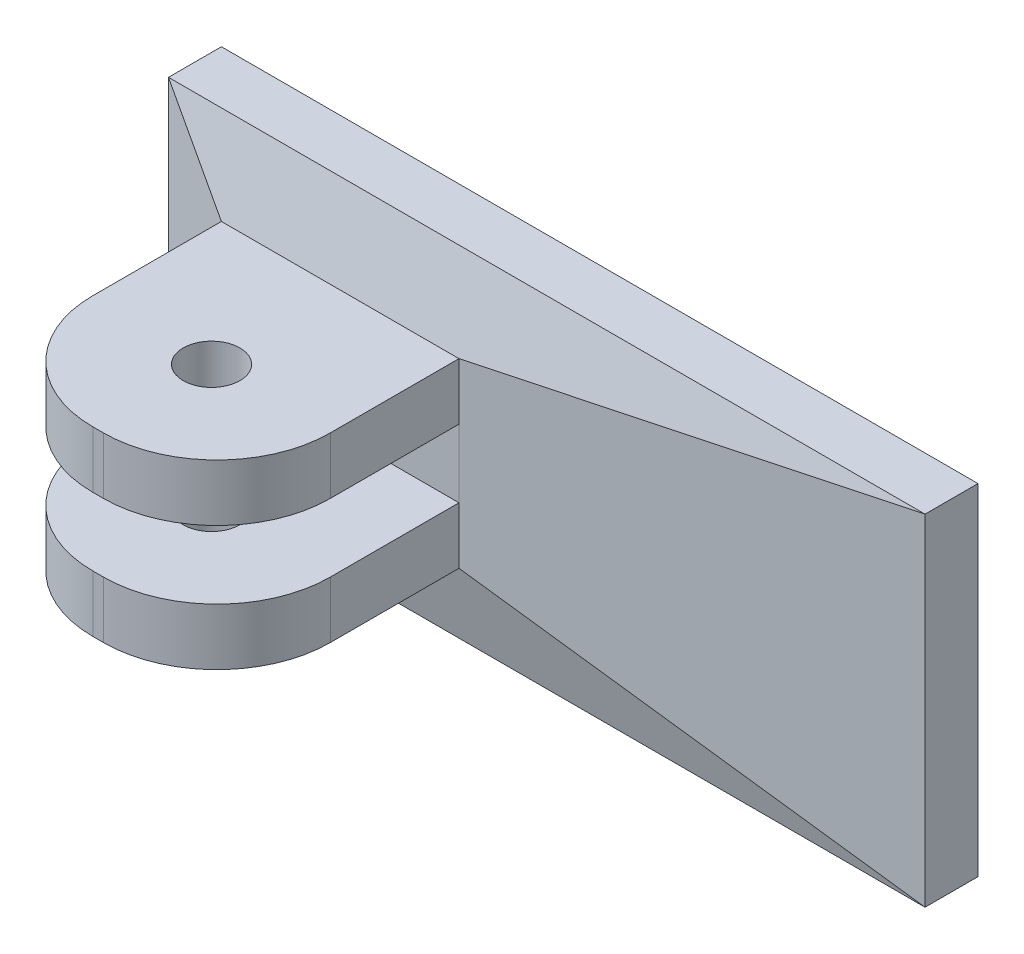
ISO-10303-21;
HEADER;
FILE_DESCRIPTION(('STEP AP214'),'2;1');
FILE_NAME('part.step','',(''),(''),'','','');
FILE_SCHEMA(('AUTOMOTIVE_DESIGN { 1 0 10303 214 1 1 1 1 }'));
ENDSEC;
DATA;
#1=APPLICATION_CONTEXT('core data for automotive mechanical design processes');
#2=APPLICATION_PROTOCOL_DEFINITION('international standard','automotive_design',2000,#1);
#3=PRODUCT_CONTEXT('',#1,'mechanical');
#4=PRODUCT('Part','Part','',(#3));
#5=PRODUCT_RELATED_PRODUCT_CATEGORY('part','',(#4));
#6=PRODUCT_DEFINITION_FORMATION('','',#4);
#7=PRODUCT_DEFINITION_CONTEXT('part definition',#1,'design');
#8=PRODUCT_DEFINITION('design','',#6,#7);
#9=PRODUCT_DEFINITION_SHAPE('','',#8);
#10=(LENGTH_UNIT() NAMED_UNIT(*) SI_UNIT(.MILLI.,.METRE.));
#11=(NAMED_UNIT(*) PLANE_ANGLE_UNIT() SI_UNIT($,.RADIAN.));
#12=(NAMED_UNIT(*) SI_UNIT($,.STERADIAN.) SOLID_ANGLE_UNIT());
#13=UNCERTAINTY_MEASURE_WITH_UNIT(LENGTH_MEASURE(1.E-05),#10,'distance_accuracy_value','');
#14=(GEOMETRIC_REPRESENTATION_CONTEXT(3) GLOBAL_UNCERTAINTY_ASSIGNED_CONTEXT((#13)) GLOBAL_UNIT_ASSIGNED_CONTEXT((#10,
#11,#12)) REPRESENTATION_CONTEXT('',''));
#15=CARTESIAN_POINT('',(0.,0.,0.));
#16=DIRECTION('',(0.,0.,1.));
#17=DIRECTION('',(1.,0.,0.));
#18=AXIS2_PLACEMENT_3D('',#15,#16,#17);
#19=CARTESIAN_POINT('',(0.,0.,10.));
#20=DIRECTION('',(0.,0.,1.));
#21=DIRECTION('',(1.,0.,0.));
#22=AXIS2_PLACEMENT_3D('',#19,#20,#21);
#23=PLANE('',#22);
#24=DIRECTION('',(0.,-1.,0.));
#25=VECTOR('',#24,1.);
#26=CARTESIAN_POINT('',(-13.9499956511895,14.8522318365415,10.));
#27=LINE('',#26,#25);
#28=CARTESIAN_POINT('',(-13.9499956511895,-2.64776816345848,10.));
#29=VERTEX_POINT('',#28);
#30=CARTESIAN_POINT('',(-13.9499956511895,-11.6477681634585,10.));
#31=VERTEX_POINT('',#30);
#32=EDGE_CURVE('E301',#29,#31,#27,.T.);
#33=ORIENTED_EDGE('',*,*,#32,.T.);
#34=DIRECTION('',(1.,0.,0.));
#35=VECTOR('',#34,1.);
#36=CARTESIAN_POINT('',(-13.9499956511895,-11.6477681634585,10.));
#37=LINE('',#36,#35);
#38=CARTESIAN_POINT('',(17.4500043488105,-11.6477681634585,10.));
#39=VERTEX_POINT('',#38);
#40=EDGE_CURVE('E228',#31,#39,#37,.T.);
#41=ORIENTED_EDGE('',*,*,#40,.T.);
#42=DIRECTION('',(0.,-1.,0.));
#43=VECTOR('',#42,1.);
#44=CARTESIAN_POINT('',(17.4500043488105,14.8522318365415,10.));
#45=LINE('',#44,#43);
#46=CARTESIAN_POINT('',(17.4500043488105,-2.64776816345848,10.));
#47=VERTEX_POINT('',#46);
#48=EDGE_CURVE('E58',#47,#39,#45,.T.);
#49=ORIENTED_EDGE('',*,*,#48,.F.);
#50=DIRECTION('',(1.,0.,0.));
#51=VECTOR('',#50,1.);
#52=CARTESIAN_POINT('',(-13.9499956511895,-2.64776816345849,10.));
#53=LINE('',#52,#51);
#54=EDGE_CURVE('E272',#29,#47,#53,.T.);
#55=ORIENTED_EDGE('',*,*,#54,.F.);
#56=EDGE_LOOP('',(#33,#41,#49,#55));
#57=FACE_BOUND('',#56,.T.);
#58=ADVANCED_FACE('F35',(#57),#23,.T.);
#59=CARTESIAN_POINT('',(-23.9499956511895,14.8522318365415,10.));
#60=DIRECTION('',(1.,0.,0.));
#61=DIRECTION('',(0.,1.,0.));
#62=AXIS2_PLACEMENT_3D('',#59,#60,#61);
#63=PLANE('',#62);
#64=DIRECTION('',(0.,0.,-1.));
#65=VECTOR('',#64,1.);
#66=CARTESIAN_POINT('',(-23.9499956511895,-30.1477681634585,10.));
#67=LINE('',#66,#65);
#68=CARTESIAN_POINT('',(-23.9499956511895,-30.1477681634585,7.));
#69=VERTEX_POINT('',#68);
#70=CARTESIAN_POINT('',(-23.9499956511895,-30.1477681634585,0.));
#71=VERTEX_POINT('',#70);
#72=EDGE_CURVE('E182',#69,#71,#67,.T.);
#73=ORIENTED_EDGE('',*,*,#72,.F.);
#74=DIRECTION('',(0.,-1.,0.));
#75=VECTOR('',#74,1.);
#76=CARTESIAN_POINT('',(-23.9499956511895,14.8522318365415,7.));
#77=LINE('',#76,#75);
#78=CARTESIAN_POINT('',(-23.9499956511895,14.8522318365415,7.));
#79=VERTEX_POINT('',#78);
#80=EDGE_CURVE('E174',#79,#69,#77,.T.);
#81=ORIENTED_EDGE('',*,*,#80,.F.);
#82=DIRECTION('',(0.,0.,-1.));
#83=VECTOR('',#82,1.);
#84=CARTESIAN_POINT('',(-23.9499956511895,14.8522318365415,10.));
#85=LINE('',#84,#83);
#86=CARTESIAN_POINT('',(-23.9499956511895,14.8522318365415,0.));
#87=VERTEX_POINT('',#86);
#88=EDGE_CURVE('E165',#79,#87,#85,.T.);
#89=ORIENTED_EDGE('',*,*,#88,.T.);
#90=DIRECTION('',(0.,-1.,0.));
#91=VECTOR('',#90,1.);
#92=CARTESIAN_POINT('',(-23.9499956511895,14.8522318365415,0.));
#93=LINE('',#92,#91);
#94=EDGE_CURVE('E290',#87,#71,#93,.T.);
#95=ORIENTED_EDGE('',*,*,#94,.T.);
#96=EDGE_LOOP('',(#73,#81,#89,#95));
#97=FACE_BOUND('',#96,.T.);
#98=ADVANCED_FACE('F37',(#97),#63,.F.);
#99=CARTESIAN_POINT('',(-23.9499956511895,-30.1477681634585,10.));
#100=DIRECTION('',(0.,1.,0.));
#101=DIRECTION('',(0.,0.,1.));
#102=AXIS2_PLACEMENT_3D('',#99,#100,#101);
#103=PLANE('',#102);
#104=DIRECTION('',(0.,0.,-1.));
#105=VECTOR('',#104,1.);
#106=CARTESIAN_POINT('',(76.0500043488105,-30.1477681634585,10.));
#107=LINE('',#106,#105);
#108=CARTESIAN_POINT('',(76.0500043488105,-30.1477681634585,7.));
#109=VERTEX_POINT('',#108);
#110=CARTESIAN_POINT('',(76.0500043488105,-30.1477681634585,0.));
#111=VERTEX_POINT('',#110);
#112=EDGE_CURVE('E180',#109,#111,#107,.T.);
#113=ORIENTED_EDGE('',*,*,#112,.F.);
#114=DIRECTION('',(-1.,0.,0.));
#115=VECTOR('',#114,1.);
#116=CARTESIAN_POINT('',(76.0500043488105,-30.1477681634585,7.));
#117=LINE('',#116,#115);
#118=EDGE_CURVE('E166',#109,#69,#117,.T.);
#119=ORIENTED_EDGE('',*,*,#118,.T.);
#120=ORIENTED_EDGE('',*,*,#72,.T.);
#121=DIRECTION('',(1.,0.,0.));
#122=VECTOR('',#121,1.);
#123=CARTESIAN_POINT('',(-23.9499956511895,-30.1477681634585,0.));
#124=LINE('',#123,#122);
#125=EDGE_CURVE('E293',#71,#111,#124,.T.);
#126=ORIENTED_EDGE('',*,*,#125,.T.);
#127=EDGE_LOOP('',(#113,#119,#120,#126));
#128=FACE_BOUND('',#127,.T.);
#129=ADVANCED_FACE('F377',(#128),#103,.F.);
#130=CARTESIAN_POINT('',(76.0500043488105,14.8522318365415,10.));
#131=DIRECTION('',(-1.,0.,0.));
#132=DIRECTION('',(0.,-1.,0.));
#133=AXIS2_PLACEMENT_3D('',#130,#131,#132);
#134=PLANE('',#133);
#135=DIRECTION('',(0.,0.,-1.));
#136=VECTOR('',#135,1.);
#137=CARTESIAN_POINT('',(76.0500043488105,14.8522318365415,10.));
#138=LINE('',#137,#136);
#139=CARTESIAN_POINT('',(76.0500043488105,14.8522318365415,7.));
#140=VERTEX_POINT('',#139);
#141=CARTESIAN_POINT('',(76.0500043488105,14.8522318365415,0.));
#142=VERTEX_POINT('',#141);
#143=EDGE_CURVE('E163',#140,#142,#138,.T.);
#144=ORIENTED_EDGE('',*,*,#143,.F.);
#145=DIRECTION('',(0.,-1.,0.));
#146=VECTOR('',#145,1.);
#147=CARTESIAN_POINT('',(76.0500043488105,14.8522318365415,7.));
#148=LINE('',#147,#146);
#149=EDGE_CURVE('E170',#140,#109,#148,.T.);
#150=ORIENTED_EDGE('',*,*,#149,.T.);
#151=ORIENTED_EDGE('',*,*,#112,.T.);
#152=DIRECTION('',(0.,1.,0.));
#153=VECTOR('',#152,1.);
#154=CARTESIAN_POINT('',(76.0500043488105,14.8522318365415,0.));
#155=LINE('',#154,#153);
#156=EDGE_CURVE('E178',#111,#142,#155,.T.);
#157=ORIENTED_EDGE('',*,*,#156,.T.);
#158=EDGE_LOOP('',(#144,#150,#151,#157));
#159=FACE_BOUND('',#158,.T.);
#160=ADVANCED_FACE('F176',(#159),#134,.F.);
#161=CARTESIAN_POINT('',(-23.9499956511895,14.8522318365415,10.));
#162=DIRECTION('',(0.,-1.,0.));
#163=DIRECTION('',(0.,0.,-1.));
#164=AXIS2_PLACEMENT_3D('',#161,#162,#163);
#165=PLANE('',#164);
#166=ORIENTED_EDGE('',*,*,#88,.F.);
#167=DIRECTION('',(-1.,0.,0.));
#168=VECTOR('',#167,1.);
#169=CARTESIAN_POINT('',(76.0500043488105,14.8522318365415,7.));
#170=LINE('',#169,#168);
#171=EDGE_CURVE('E151',#140,#79,#170,.T.);
#172=ORIENTED_EDGE('',*,*,#171,.F.);
#173=ORIENTED_EDGE('',*,*,#143,.T.);
#174=DIRECTION('',(-1.,0.,0.));
#175=VECTOR('',#174,1.);
#176=CARTESIAN_POINT('',(-23.9499956511895,14.8522318365415,0.));
#177=LINE('',#176,#175);
#178=EDGE_CURVE('E184',#142,#87,#177,.T.);
#179=ORIENTED_EDGE('',*,*,#178,.T.);
#180=EDGE_LOOP('',(#166,#172,#173,#179));
#181=FACE_BOUND('',#180,.T.);
#182=ADVANCED_FACE('F160',(#181),#165,.F.);
#183=CARTESIAN_POINT('',(0.,0.,0.));
#184=DIRECTION('',(0.,0.,1.));
#185=DIRECTION('',(1.,0.,0.));
#186=AXIS2_PLACEMENT_3D('',#183,#184,#185);
#187=PLANE('',#186);
#188=ORIENTED_EDGE('',*,*,#94,.F.);
#189=ORIENTED_EDGE('',*,*,#178,.F.);
#190=ORIENTED_EDGE('',*,*,#156,.F.);
#191=ORIENTED_EDGE('',*,*,#125,.F.);
#192=EDGE_LOOP('',(#188,#189,#190,#191));
#193=FACE_BOUND('',#192,.T.);
#194=ADVANCED_FACE('F299',(#193),#187,.F.);
#195=CARTESIAN_POINT('',(-13.9499956511895,4.85223183654151,15.));
#196=DIRECTION('',(1.,0.,0.));
#197=DIRECTION('',(0.,1.,0.));
#198=AXIS2_PLACEMENT_3D('',#195,#196,#197);
#199=PLANE('',#198);
#200=DIRECTION('',(0.,-1.,0.));
#201=VECTOR('',#200,1.);
#202=CARTESIAN_POINT('',(-13.9499956511895,4.85223183654151,10.));
#203=LINE('',#202,#201);
#204=CARTESIAN_POINT('',(-13.9499956511895,4.85223183654151,10.));
#205=VERTEX_POINT('',#204);
#206=EDGE_CURVE('E263',#205,#29,#203,.T.);
#207=ORIENTED_EDGE('',*,*,#206,.T.);
#208=DIRECTION('',(0.,0.,-1.));
#209=VECTOR('',#208,1.);
#210=CARTESIAN_POINT('',(-13.9499956511895,-2.64776816345849,15.));
#211=LINE('',#210,#209);
#212=CARTESIAN_POINT('',(-13.9499956511895,-2.64776816345849,27.));
#213=VERTEX_POINT('',#212);
#214=EDGE_CURVE('E287',#213,#29,#211,.T.);
#215=ORIENTED_EDGE('',*,*,#214,.F.);
#216=DIRECTION('',(0.,-1.,0.));
#217=VECTOR('',#216,1.);
#218=CARTESIAN_POINT('',(-13.9499956511895,4.85223183654151,27.));
#219=LINE('',#218,#217);
#220=CARTESIAN_POINT('',(-13.9499956511895,4.85223183654151,27.));
#221=VERTEX_POINT('',#220);
#222=EDGE_CURVE('E260',#221,#213,#219,.T.);
#223=ORIENTED_EDGE('',*,*,#222,.F.);
#224=DIRECTION('',(0.,0.,-1.));
#225=VECTOR('',#224,1.);
#226=CARTESIAN_POINT('',(-13.9499956511895,4.85223183654151,15.));
#227=LINE('',#226,#225);
#228=EDGE_CURVE('E279',#221,#205,#227,.T.);
#229=ORIENTED_EDGE('',*,*,#228,.T.);
#230=EDGE_LOOP('',(#207,#215,#223,#229));
#231=FACE_BOUND('',#230,.T.);
#232=ADVANCED_FACE('F345',(#231),#199,.F.);
#233=CARTESIAN_POINT('',(-13.9499956511895,-2.64776816345849,15.));
#234=DIRECTION('',(0.,1.,0.));
#235=DIRECTION('',(0.,0.,1.));
#236=AXIS2_PLACEMENT_3D('',#233,#234,#235);
#237=PLANE('',#236);
#238=ORIENTED_EDGE('',*,*,#54,.T.);
#239=DIRECTION('',(0.,0.,-1.));
#240=VECTOR('',#239,1.);
#241=CARTESIAN_POINT('',(17.4500043488105,-2.64776816345849,15.));
#242=LINE('',#241,#240);
#243=CARTESIAN_POINT('',(17.4500043488105,-2.64776816345849,27.));
#244=VERTEX_POINT('',#243);
#245=EDGE_CURVE('E284',#244,#47,#242,.T.);
#246=ORIENTED_EDGE('',*,*,#245,.F.);
#247=CARTESIAN_POINT('',(2.45000434881047,-2.64776816345849,27.));
#248=DIRECTION('',(0.,-1.,0.));
#249=DIRECTION('',(0.,0.,1.));
#250=AXIS2_PLACEMENT_3D('',#247,#248,#249);
#251=CIRCLE('',#250,15.);
#252=CARTESIAN_POINT('',(2.45000434881047,-2.64776816345849,42.));
#253=VERTEX_POINT('',#252);
#254=EDGE_CURVE('E239',#244,#253,#251,.T.);
#255=ORIENTED_EDGE('',*,*,#254,.T.);
#256=DIRECTION('',(-1.,0.,0.));
#257=VECTOR('',#256,1.);
#258=CARTESIAN_POINT('',(1.05000434881047,-2.64776816345849,42.));
#259=LINE('',#258,#257);
#260=CARTESIAN_POINT('',(1.05000434881047,-2.64776816345849,42.));
#261=VERTEX_POINT('',#260);
#262=EDGE_CURVE('E255',#253,#261,#259,.T.);
#263=ORIENTED_EDGE('',*,*,#262,.T.);
#264=CARTESIAN_POINT('',(1.05000434881047,-2.64776816345849,27.));
#265=DIRECTION('',(0.,-1.,0.));
#266=DIRECTION('',(0.,0.,1.));
#267=AXIS2_PLACEMENT_3D('',#264,#265,#266);
#268=CIRCLE('',#267,15.);
#269=EDGE_CURVE('E246',#261,#213,#268,.T.);
#270=ORIENTED_EDGE('',*,*,#269,.T.);
#271=ORIENTED_EDGE('',*,*,#214,.T.);
#272=EDGE_LOOP('',(#238,#246,#255,#263,#270,#271));
#273=FACE_BOUND('',#272,.T.);
#274=CARTESIAN_POINT('',(1.74489016758516,-2.64776816345849,27.));
#275=DIRECTION('',(0.,-1.,0.));
#276=DIRECTION('',(0.,0.,-1.));
#277=AXIS2_PLACEMENT_3D('',#274,#275,#276);
#278=CIRCLE('',#277,3.75);
#279=CARTESIAN_POINT('',(1.74489016758516,-2.64776816345849,23.25));
#280=VERTEX_POINT('',#279);
#281=EDGE_CURVE('E209',#280,#280,#278,.T.);
#282=ORIENTED_EDGE('',*,*,#281,.F.);
#283=EDGE_LOOP('',(#282));
#284=FACE_BOUND('',#283,.T.);
#285=ADVANCED_FACE('F340',(#273,#284),#237,.F.);
#286=CARTESIAN_POINT('',(17.4500043488105,4.85223183654151,15.));
#287=DIRECTION('',(-1.,0.,0.));
#288=DIRECTION('',(0.,0.,1.));
#289=AXIS2_PLACEMENT_3D('',#286,#287,#288);
#290=PLANE('',#289);
#291=DIRECTION('',(0.,1.,0.));
#292=VECTOR('',#291,1.);
#293=CARTESIAN_POINT('',(17.4500043488105,4.85223183654151,10.));
#294=LINE('',#293,#292);
#295=CARTESIAN_POINT('',(17.4500043488104,4.85223183654151,10.));
#296=VERTEX_POINT('',#295);
#297=EDGE_CURVE('E275',#47,#296,#294,.T.);
#298=ORIENTED_EDGE('',*,*,#297,.T.);
#299=DIRECTION('',(0.,0.,-1.));
#300=VECTOR('',#299,1.);
#301=CARTESIAN_POINT('',(17.4500043488105,4.85223183654151,15.));
#302=LINE('',#301,#300);
#303=CARTESIAN_POINT('',(17.4500043488105,4.85223183654151,27.));
#304=VERTEX_POINT('',#303);
#305=EDGE_CURVE('E282',#304,#296,#302,.T.);
#306=ORIENTED_EDGE('',*,*,#305,.F.);
#307=DIRECTION('',(0.,-1.,0.));
#308=VECTOR('',#307,1.);
#309=CARTESIAN_POINT('',(17.4500043488105,4.85223183654151,27.));
#310=LINE('',#309,#308);
#311=EDGE_CURVE('E252',#304,#244,#310,.T.);
#312=ORIENTED_EDGE('',*,*,#311,.T.);
#313=ORIENTED_EDGE('',*,*,#245,.T.);
#314=EDGE_LOOP('',(#298,#306,#312,#313));
#315=FACE_BOUND('',#314,.T.);
#316=ADVANCED_FACE('F354',(#315),#290,.F.);
#317=CARTESIAN_POINT('',(-13.9499956511895,4.85223183654151,15.));
#318=DIRECTION('',(0.,-1.,0.));
#319=DIRECTION('',(0.,0.,-1.));
#320=AXIS2_PLACEMENT_3D('',#317,#318,#319);
#321=PLANE('',#320);
#322=DIRECTION('',(-1.,0.,0.));
#323=VECTOR('',#322,1.);
#324=CARTESIAN_POINT('',(-13.9499956511895,4.85223183654151,10.));
#325=LINE('',#324,#323);
#326=EDGE_CURVE('E153',#296,#205,#325,.T.);
#327=ORIENTED_EDGE('',*,*,#326,.T.);
#328=ORIENTED_EDGE('',*,*,#228,.F.);
#329=CARTESIAN_POINT('',(1.05000434881047,4.85223183654151,27.));
#330=DIRECTION('',(0.,-1.,0.));
#331=DIRECTION('',(0.,0.,1.));
#332=AXIS2_PLACEMENT_3D('',#329,#330,#331);
#333=CIRCLE('',#332,15.);
#334=CARTESIAN_POINT('',(1.05000434881047,4.85223183654151,42.));
#335=VERTEX_POINT('',#334);
#336=EDGE_CURVE('E249',#335,#221,#333,.T.);
#337=ORIENTED_EDGE('',*,*,#336,.F.);
#338=DIRECTION('',(-1.,0.,0.));
#339=VECTOR('',#338,1.);
#340=CARTESIAN_POINT('',(1.05000434881047,4.85223183654151,42.));
#341=LINE('',#340,#339);
#342=CARTESIAN_POINT('',(2.45000434881047,4.85223183654151,42.));
#343=VERTEX_POINT('',#342);
#344=EDGE_CURVE('E245',#343,#335,#341,.T.);
#345=ORIENTED_EDGE('',*,*,#344,.F.);
#346=CARTESIAN_POINT('',(2.45000434881047,4.85223183654151,27.));
#347=DIRECTION('',(0.,-1.,0.));
#348=DIRECTION('',(0.,0.,1.));
#349=AXIS2_PLACEMENT_3D('',#346,#347,#348);
#350=CIRCLE('',#349,15.);
#351=EDGE_CURVE('E242',#304,#343,#350,.T.);
#352=ORIENTED_EDGE('',*,*,#351,.F.);
#353=ORIENTED_EDGE('',*,*,#305,.T.);
#354=EDGE_LOOP('',(#327,#328,#337,#345,#352,#353));
#355=FACE_BOUND('',#354,.T.);
#356=CARTESIAN_POINT('',(1.74489016758516,4.85223183654151,27.));
#357=DIRECTION('',(0.,-1.,0.));
#358=DIRECTION('',(0.,0.,-1.));
#359=AXIS2_PLACEMENT_3D('',#356,#357,#358);
#360=CIRCLE('',#359,3.75);
#361=CARTESIAN_POINT('',(1.74489016758516,4.85223183654151,23.25));
#362=VERTEX_POINT('',#361);
#363=EDGE_CURVE('E236',#362,#362,#360,.T.);
#364=ORIENTED_EDGE('',*,*,#363,.T.);
#365=EDGE_LOOP('',(#364));
#366=FACE_BOUND('',#365,.T.);
#367=ADVANCED_FACE('F348',(#355,#366),#321,.F.);
#368=CARTESIAN_POINT('',(1.05000434881047,4.85223183654151,27.));
#369=DIRECTION('',(0.,-1.,0.));
#370=DIRECTION('',(0.,0.,-1.));
#371=AXIS2_PLACEMENT_3D('',#368,#369,#370);
#372=CYLINDRICAL_SURFACE('',#371,15.);
#373=ORIENTED_EDGE('',*,*,#269,.F.);
#374=DIRECTION('',(0.,-1.,0.));
#375=VECTOR('',#374,1.);
#376=CARTESIAN_POINT('',(1.05000434881047,4.85223183654151,42.));
#377=LINE('',#376,#375);
#378=EDGE_CURVE('E264',#335,#261,#377,.T.);
#379=ORIENTED_EDGE('',*,*,#378,.F.);
#380=ORIENTED_EDGE('',*,*,#336,.T.);
#381=ORIENTED_EDGE('',*,*,#222,.T.);
#382=EDGE_LOOP('',(#373,#379,#380,#381));
#383=FACE_BOUND('',#382,.T.);
#384=ADVANCED_FACE('F362',(#383),#372,.T.);
#385=CARTESIAN_POINT('',(1.05000434881047,4.85223183654151,42.));
#386=DIRECTION('',(0.,0.,1.));
#387=DIRECTION('',(1.,0.,0.));
#388=AXIS2_PLACEMENT_3D('',#385,#386,#387);
#389=PLANE('',#388);
#390=ORIENTED_EDGE('',*,*,#262,.F.);
#391=DIRECTION('',(0.,-1.,0.));
#392=VECTOR('',#391,1.);
#393=CARTESIAN_POINT('',(2.45000434881047,4.85223183654151,42.));
#394=LINE('',#393,#392);
#395=EDGE_CURVE('E266',#343,#253,#394,.T.);
#396=ORIENTED_EDGE('',*,*,#395,.F.);
#397=ORIENTED_EDGE('',*,*,#344,.T.);
#398=ORIENTED_EDGE('',*,*,#378,.T.);
#399=EDGE_LOOP('',(#390,#396,#397,#398));
#400=FACE_BOUND('',#399,.T.);
#401=ADVANCED_FACE('F360',(#400),#389,.T.);
#402=CARTESIAN_POINT('',(2.45000434881047,4.85223183654151,27.));
#403=DIRECTION('',(0.,-1.,0.));
#404=DIRECTION('',(0.,0.,-1.));
#405=AXIS2_PLACEMENT_3D('',#402,#403,#404);
#406=CYLINDRICAL_SURFACE('',#405,15.);
#407=ORIENTED_EDGE('',*,*,#254,.F.);
#408=ORIENTED_EDGE('',*,*,#311,.F.);
#409=ORIENTED_EDGE('',*,*,#351,.T.);
#410=ORIENTED_EDGE('',*,*,#395,.T.);
#411=EDGE_LOOP('',(#407,#408,#409,#410));
#412=FACE_BOUND('',#411,.T.);
#413=ADVANCED_FACE('F358',(#412),#406,.T.);
#414=CARTESIAN_POINT('',(1.74489016758516,4.85223183654151,27.));
#415=DIRECTION('',(0.,-1.,0.));
#416=DIRECTION('',(0.,0.,-1.));
#417=AXIS2_PLACEMENT_3D('',#414,#415,#416);
#418=CYLINDRICAL_SURFACE('',#417,3.75);
#419=ORIENTED_EDGE('',*,*,#363,.F.);
#420=EDGE_LOOP('',(#419));
#421=FACE_BOUND('',#420,.T.);
#422=ORIENTED_EDGE('',*,*,#281,.T.);
#423=EDGE_LOOP('',(#422));
#424=FACE_BOUND('',#423,.T.);
#425=ADVANCED_FACE('F421',(#421,#424),#418,.F.);
#426=CARTESIAN_POINT('',(-13.9499956511895,-19.1477681634585,15.));
#427=DIRECTION('',(-1.,0.,0.));
#428=DIRECTION('',(0.,-1.,0.));
#429=AXIS2_PLACEMENT_3D('',#426,#427,#428);
#430=PLANE('',#429);
#431=DIRECTION('',(0.,1.,0.));
#432=VECTOR('',#431,1.);
#433=CARTESIAN_POINT('',(-13.9499956511895,-19.1477681634585,10.));
#434=LINE('',#433,#432);
#435=CARTESIAN_POINT('',(-13.9499956511895,-19.1477681634585,10.));
#436=VERTEX_POINT('',#435);
#437=EDGE_CURVE('E194',#436,#31,#434,.T.);
#438=ORIENTED_EDGE('',*,*,#437,.F.);
#439=DIRECTION('',(0.,0.,-1.));
#440=VECTOR('',#439,1.);
#441=CARTESIAN_POINT('',(-13.9499956511895,-19.1477681634585,15.));
#442=LINE('',#441,#440);
#443=CARTESIAN_POINT('',(-13.9499956511895,-19.1477681634585,27.));
#444=VERTEX_POINT('',#443);
#445=EDGE_CURVE('E201',#444,#436,#442,.T.);
#446=ORIENTED_EDGE('',*,*,#445,.F.);
#447=DIRECTION('',(0.,1.,0.));
#448=VECTOR('',#447,1.);
#449=CARTESIAN_POINT('',(-13.9499956511895,-19.1477681634585,27.));
#450=LINE('',#449,#448);
#451=CARTESIAN_POINT('',(-13.9499956511895,-11.6477681634585,27.));
#452=VERTEX_POINT('',#451);
#453=EDGE_CURVE('E224',#444,#452,#450,.T.);
#454=ORIENTED_EDGE('',*,*,#453,.T.);
#455=DIRECTION('',(0.,0.,-1.));
#456=VECTOR('',#455,1.);
#457=CARTESIAN_POINT('',(-13.9499956511895,-11.6477681634585,15.));
#458=LINE('',#457,#456);
#459=EDGE_CURVE('E214',#452,#31,#458,.T.);
#460=ORIENTED_EDGE('',*,*,#459,.T.);
#461=EDGE_LOOP('',(#438,#446,#454,#460));
#462=FACE_BOUND('',#461,.T.);
#463=ADVANCED_FACE('F213',(#462),#430,.T.);
#464=CARTESIAN_POINT('',(-13.9499956511895,-19.1477681634585,15.));
#465=DIRECTION('',(0.,-1.,0.));
#466=DIRECTION('',(0.,0.,-1.));
#467=AXIS2_PLACEMENT_3D('',#464,#465,#466);
#468=PLANE('',#467);
#469=DIRECTION('',(-1.,0.,0.));
#470=VECTOR('',#469,1.);
#471=CARTESIAN_POINT('',(-13.9499956511895,-19.1477681634585,10.));
#472=LINE('',#471,#470);
#473=CARTESIAN_POINT('',(17.4500043488111,-19.1477681634585,9.99999999999998));
#474=VERTEX_POINT('',#473);
#475=EDGE_CURVE('E50',#474,#436,#472,.T.);
#476=ORIENTED_EDGE('',*,*,#475,.F.);
#477=DIRECTION('',(0.,0.,-1.));
#478=VECTOR('',#477,1.);
#479=CARTESIAN_POINT('',(17.4500043488105,-19.1477681634585,15.));
#480=LINE('',#479,#478);
#481=CARTESIAN_POINT('',(17.4500043488105,-19.1477681634585,27.));
#482=VERTEX_POINT('',#481);
#483=EDGE_CURVE('E210',#482,#474,#480,.T.);
#484=ORIENTED_EDGE('',*,*,#483,.F.);
#485=CARTESIAN_POINT('',(2.45000434881047,-19.1477681634585,27.));
#486=DIRECTION('',(0.,-1.,0.));
#487=DIRECTION('',(0.,0.,1.));
#488=AXIS2_PLACEMENT_3D('',#485,#486,#487);
#489=CIRCLE('',#488,15.);
#490=CARTESIAN_POINT('',(2.45000434881047,-19.1477681634585,42.));
#491=VERTEX_POINT('',#490);
#492=EDGE_CURVE('E317',#482,#491,#489,.T.);
#493=ORIENTED_EDGE('',*,*,#492,.T.);
#494=DIRECTION('',(-1.,0.,0.));
#495=VECTOR('',#494,1.);
#496=CARTESIAN_POINT('',(1.05000434881047,-19.1477681634585,42.));
#497=LINE('',#496,#495);
#498=CARTESIAN_POINT('',(1.05000434881047,-19.1477681634585,42.));
#499=VERTEX_POINT('',#498);
#500=EDGE_CURVE('E314',#491,#499,#497,.T.);
#501=ORIENTED_EDGE('',*,*,#500,.T.);
#502=CARTESIAN_POINT('',(1.05000434881047,-19.1477681634585,27.));
#503=DIRECTION('',(0.,-1.,0.));
#504=DIRECTION('',(0.,0.,1.));
#505=AXIS2_PLACEMENT_3D('',#502,#503,#504);
#506=CIRCLE('',#505,15.);
#507=EDGE_CURVE('E205',#499,#444,#506,.T.);
#508=ORIENTED_EDGE('',*,*,#507,.T.);
#509=ORIENTED_EDGE('',*,*,#445,.T.);
#510=EDGE_LOOP('',(#476,#484,#493,#501,#508,#509));
#511=FACE_BOUND('',#510,.T.);
#512=CARTESIAN_POINT('',(1.74489016758516,-19.1477681634585,27.));
#513=DIRECTION('',(0.,-1.,0.));
#514=DIRECTION('',(0.,0.,-1.));
#515=AXIS2_PLACEMENT_3D('',#512,#513,#514);
#516=CIRCLE('',#515,3.75);
#517=CARTESIAN_POINT('',(1.74489016758516,-19.1477681634585,23.25));
#518=VERTEX_POINT('',#517);
#519=EDGE_CURVE('E307',#518,#518,#516,.T.);
#520=ORIENTED_EDGE('',*,*,#519,.F.);
#521=EDGE_LOOP('',(#520));
#522=FACE_BOUND('',#521,.T.);
#523=ADVANCED_FACE('F202',(#511,#522),#468,.T.);
#524=CARTESIAN_POINT('',(17.4500043488105,-19.1477681634585,15.));
#525=DIRECTION('',(1.,0.,0.));
#526=DIRECTION('',(0.,0.,-1.));
#527=AXIS2_PLACEMENT_3D('',#524,#525,#526);
#528=PLANE('',#527);
#529=DIRECTION('',(0.,-1.,0.));
#530=VECTOR('',#529,1.);
#531=CARTESIAN_POINT('',(17.4500043488105,-19.1477681634585,10.));
#532=LINE('',#531,#530);
#533=EDGE_CURVE('E218',#39,#474,#532,.T.);
#534=ORIENTED_EDGE('',*,*,#533,.F.);
#535=DIRECTION('',(0.,0.,-1.));
#536=VECTOR('',#535,1.);
#537=CARTESIAN_POINT('',(17.4500043488105,-11.6477681634585,15.));
#538=LINE('',#537,#536);
#539=CARTESIAN_POINT('',(17.4500043488105,-11.6477681634585,27.));
#540=VERTEX_POINT('',#539);
#541=EDGE_CURVE('E231',#540,#39,#538,.T.);
#542=ORIENTED_EDGE('',*,*,#541,.F.);
#543=DIRECTION('',(0.,1.,0.));
#544=VECTOR('',#543,1.);
#545=CARTESIAN_POINT('',(17.4500043488105,-19.1477681634585,27.));
#546=LINE('',#545,#544);
#547=EDGE_CURVE('E216',#482,#540,#546,.T.);
#548=ORIENTED_EDGE('',*,*,#547,.F.);
#549=ORIENTED_EDGE('',*,*,#483,.T.);
#550=EDGE_LOOP('',(#534,#542,#548,#549));
#551=FACE_BOUND('',#550,.T.);
#552=ADVANCED_FACE('F395',(#551),#528,.T.);
#553=CARTESIAN_POINT('',(-13.9499956511895,-11.6477681634585,15.));
#554=DIRECTION('',(0.,1.,0.));
#555=DIRECTION('',(0.,0.,1.));
#556=AXIS2_PLACEMENT_3D('',#553,#554,#555);
#557=PLANE('',#556);
#558=ORIENTED_EDGE('',*,*,#40,.F.);
#559=ORIENTED_EDGE('',*,*,#459,.F.);
#560=CARTESIAN_POINT('',(1.05000434881047,-11.6477681634585,27.));
#561=DIRECTION('',(0.,-1.,0.));
#562=DIRECTION('',(0.,0.,1.));
#563=AXIS2_PLACEMENT_3D('',#560,#561,#562);
#564=CIRCLE('',#563,15.);
#565=CARTESIAN_POINT('',(1.05000434881047,-11.6477681634585,42.));
#566=VERTEX_POINT('',#565);
#567=EDGE_CURVE('E310',#566,#452,#564,.T.);
#568=ORIENTED_EDGE('',*,*,#567,.F.);
#569=DIRECTION('',(-1.,0.,0.));
#570=VECTOR('',#569,1.);
#571=CARTESIAN_POINT('',(1.05000434881047,-11.6477681634585,42.));
#572=LINE('',#571,#570);
#573=CARTESIAN_POINT('',(2.45000434881047,-11.6477681634585,42.));
#574=VERTEX_POINT('',#573);
#575=EDGE_CURVE('E321',#574,#566,#572,.T.);
#576=ORIENTED_EDGE('',*,*,#575,.F.);
#577=CARTESIAN_POINT('',(2.45000434881047,-11.6477681634585,27.));
#578=DIRECTION('',(0.,-1.,0.));
#579=DIRECTION('',(0.,0.,1.));
#580=AXIS2_PLACEMENT_3D('',#577,#578,#579);
#581=CIRCLE('',#580,15.);
#582=EDGE_CURVE('E315',#540,#574,#581,.T.);
#583=ORIENTED_EDGE('',*,*,#582,.F.);
#584=ORIENTED_EDGE('',*,*,#541,.T.);
#585=EDGE_LOOP('',(#558,#559,#568,#576,#583,#584));
#586=FACE_BOUND('',#585,.T.);
#587=CARTESIAN_POINT('',(1.74489016758516,-11.6477681634585,27.));
#588=DIRECTION('',(0.,-1.,0.));
#589=DIRECTION('',(0.,0.,-1.));
#590=AXIS2_PLACEMENT_3D('',#587,#588,#589);
#591=CIRCLE('',#590,3.75);
#592=CARTESIAN_POINT('',(1.74489016758516,-11.6477681634585,23.25));
#593=VERTEX_POINT('',#592);
#594=EDGE_CURVE('E303',#593,#593,#591,.T.);
#595=ORIENTED_EDGE('',*,*,#594,.T.);
#596=EDGE_LOOP('',(#595));
#597=FACE_BOUND('',#596,.T.);
#598=ADVANCED_FACE('F333',(#586,#597),#557,.T.);
#599=CARTESIAN_POINT('',(2.45000434881047,-19.1477681634585,27.));
#600=DIRECTION('',(0.,1.,0.));
#601=DIRECTION('',(0.,0.,1.));
#602=AXIS2_PLACEMENT_3D('',#599,#600,#601);
#603=CYLINDRICAL_SURFACE('',#602,15.);
#604=ORIENTED_EDGE('',*,*,#582,.T.);
#605=DIRECTION('',(0.,1.,0.));
#606=VECTOR('',#605,1.);
#607=CARTESIAN_POINT('',(2.45000434881047,-19.1477681634585,42.));
#608=LINE('',#607,#606);
#609=EDGE_CURVE('E221',#491,#574,#608,.T.);
#610=ORIENTED_EDGE('',*,*,#609,.F.);
#611=ORIENTED_EDGE('',*,*,#492,.F.);
#612=ORIENTED_EDGE('',*,*,#547,.T.);
#613=EDGE_LOOP('',(#604,#610,#611,#612));
#614=FACE_BOUND('',#613,.T.);
#615=ADVANCED_FACE('F400',(#614),#603,.T.);
#616=CARTESIAN_POINT('',(1.05000434881047,-19.1477681634585,42.));
#617=DIRECTION('',(0.,0.,-1.));
#618=DIRECTION('',(-1.,0.,0.));
#619=AXIS2_PLACEMENT_3D('',#616,#617,#618);
#620=PLANE('',#619);
#621=ORIENTED_EDGE('',*,*,#575,.T.);
#622=DIRECTION('',(0.,1.,0.));
#623=VECTOR('',#622,1.);
#624=CARTESIAN_POINT('',(1.05000434881047,-19.1477681634585,42.));
#625=LINE('',#624,#623);
#626=EDGE_CURVE('E325',#499,#566,#625,.T.);
#627=ORIENTED_EDGE('',*,*,#626,.F.);
#628=ORIENTED_EDGE('',*,*,#500,.F.);
#629=ORIENTED_EDGE('',*,*,#609,.T.);
#630=EDGE_LOOP('',(#621,#627,#628,#629));
#631=FACE_BOUND('',#630,.T.);
#632=ADVANCED_FACE('F402',(#631),#620,.F.);
#633=CARTESIAN_POINT('',(1.05000434881047,-19.1477681634585,27.));
#634=DIRECTION('',(0.,1.,0.));
#635=DIRECTION('',(0.,0.,1.));
#636=AXIS2_PLACEMENT_3D('',#633,#634,#635);
#637=CYLINDRICAL_SURFACE('',#636,15.);
#638=ORIENTED_EDGE('',*,*,#567,.T.);
#639=ORIENTED_EDGE('',*,*,#453,.F.);
#640=ORIENTED_EDGE('',*,*,#507,.F.);
#641=ORIENTED_EDGE('',*,*,#626,.T.);
#642=EDGE_LOOP('',(#638,#639,#640,#641));
#643=FACE_BOUND('',#642,.T.);
#644=ADVANCED_FACE('F330',(#643),#637,.T.);
#645=CARTESIAN_POINT('',(1.74489016758516,-19.1477681634585,27.));
#646=DIRECTION('',(0.,1.,0.));
#647=DIRECTION('',(0.,0.,1.));
#648=AXIS2_PLACEMENT_3D('',#645,#646,#647);
#649=CYLINDRICAL_SURFACE('',#648,3.75);
#650=ORIENTED_EDGE('',*,*,#519,.T.);
#651=EDGE_LOOP('',(#650));
#652=FACE_BOUND('',#651,.T.);
#653=ORIENTED_EDGE('',*,*,#594,.F.);
#654=EDGE_LOOP('',(#653));
#655=FACE_BOUND('',#654,.T.);
#656=ADVANCED_FACE('F409',(#652,#655),#649,.F.);
#657=CARTESIAN_POINT('',(17.4500043488105,14.8522318365415,10.));
#658=DIRECTION('',(-0.0511275834390955,0.,-0.998692129843666));
#659=DIRECTION('',(-0.998692129843666,0.,0.0511275834390955));
#660=AXIS2_PLACEMENT_3D('',#657,#658,#659);
#661=PLANE('',#660);
#662=ORIENTED_EDGE('',*,*,#149,.F.);
#663=DIRECTION('',(-0.984497213887377,-0.168002937523443,0.050400881257033));
#664=VECTOR('',#663,1.);
#665=CARTESIAN_POINT('',(19.1039885879777,5.13448170670658,9.91532503895048));
#666=LINE('',#665,#664);
#667=EDGE_CURVE('E148',#140,#296,#666,.T.);
#668=ORIENTED_EDGE('',*,*,#667,.T.);
#669=ORIENTED_EDGE('',*,*,#297,.F.);
#670=ORIENTED_EDGE('',*,*,#48,.T.);
#671=ORIENTED_EDGE('',*,*,#533,.T.);
#672=DIRECTION('',(0.981592441293711,-0.184257966795747,-0.0502521727624767));
#673=VECTOR('',#672,1.);
#674=CARTESIAN_POINT('',(11.3005526153455,-17.9934342203166,10.3148183481296));
#675=LINE('',#674,#673);
#676=EDGE_CURVE('E156',#474,#109,#675,.T.);
#677=ORIENTED_EDGE('',*,*,#676,.T.);
#678=EDGE_LOOP('',(#662,#668,#669,#670,#671,#677));
#679=FACE_BOUND('',#678,.T.);
#680=ADVANCED_FACE('F171',(#679),#661,.F.);
#681=CARTESIAN_POINT('',(-13.9499956511895,14.8522318365415,10.));
#682=DIRECTION('',(0.287347885566346,0.,-0.957826285221151));
#683=DIRECTION('',(-0.957826285221151,0.,-0.287347885566346));
#684=AXIS2_PLACEMENT_3D('',#681,#682,#683);
#685=PLANE('',#684);
#686=ORIENTED_EDGE('',*,*,#206,.F.);
#687=DIRECTION('',(-0.691714463866074,0.691714463866075,-0.207514339159823));
#688=VECTOR('',#687,1.);
#689=CARTESIAN_POINT('',(-18.7346846464048,9.63692083175683,8.56459330143541));
#690=LINE('',#689,#688);
#691=EDGE_CURVE('E11',#205,#79,#690,.T.);
#692=ORIENTED_EDGE('',*,*,#691,.T.);
#693=ORIENTED_EDGE('',*,*,#80,.T.);
#694=DIRECTION('',(0.659380473395787,0.725318520735366,0.197814142018736));
#695=VECTOR('',#694,1.);
#696=CARTESIAN_POINT('',(2.31087391402786,-1.26081164171934,14.8782608695652));
#697=LINE('',#696,#695);
#698=EDGE_CURVE('E43',#69,#436,#697,.T.);
#699=ORIENTED_EDGE('',*,*,#698,.T.);
#700=ORIENTED_EDGE('',*,*,#437,.T.);
#701=ORIENTED_EDGE('',*,*,#32,.F.);
#702=EDGE_LOOP('',(#686,#692,#693,#699,#700,#701));
#703=FACE_BOUND('',#702,.T.);
#704=ADVANCED_FACE('F192',(#703),#685,.F.);
#705=CARTESIAN_POINT('',(76.0500043488105,-19.1477681634585,10.));
#706=DIRECTION('',(0.,0.263117405792109,-0.964763821237732));
#707=DIRECTION('',(0.,0.964763821237732,0.263117405792109));
#708=AXIS2_PLACEMENT_3D('',#705,#706,#707);
#709=PLANE('',#708);
#710=ORIENTED_EDGE('',*,*,#475,.T.);
#711=ORIENTED_EDGE('',*,*,#698,.F.);
#712=ORIENTED_EDGE('',*,*,#118,.F.);
#713=ORIENTED_EDGE('',*,*,#676,.F.);
#714=EDGE_LOOP('',(#710,#711,#712,#713));
#715=FACE_BOUND('',#714,.T.);
#716=ADVANCED_FACE('F392',(#715),#709,.F.);
#717=CARTESIAN_POINT('',(76.0500043488105,14.8522318365415,7.));
#718=DIRECTION('',(0.,-0.287347885566345,-0.957826285221151));
#719=DIRECTION('',(0.,0.957826285221151,-0.287347885566345));
#720=AXIS2_PLACEMENT_3D('',#717,#718,#719);
#721=PLANE('',#720);
#722=ORIENTED_EDGE('',*,*,#171,.T.);
#723=ORIENTED_EDGE('',*,*,#691,.F.);
#724=ORIENTED_EDGE('',*,*,#326,.F.);
#725=ORIENTED_EDGE('',*,*,#667,.F.);
#726=EDGE_LOOP('',(#722,#723,#724,#725));
#727=FACE_BOUND('',#726,.T.);
#728=ADVANCED_FACE('F150',(#727),#721,.F.);
#729=CLOSED_SHELL('',(#58,#98,#129,#160,#182,#194,#232,#285,#316,#367,#384,#401,#413,#425,#463,
#523,#552,#598,#615,#632,#644,#656,#680,#704,#716,#728));
#730=MANIFOLD_SOLID_BREP('B2',#729);
#731=ADVANCED_BREP_SHAPE_REPRESENTATION('',(#18,#730),#14);
#732=SHAPE_DEFINITION_REPRESENTATION(#9,#731);
ENDSEC;
END-ISO-10303-21;
